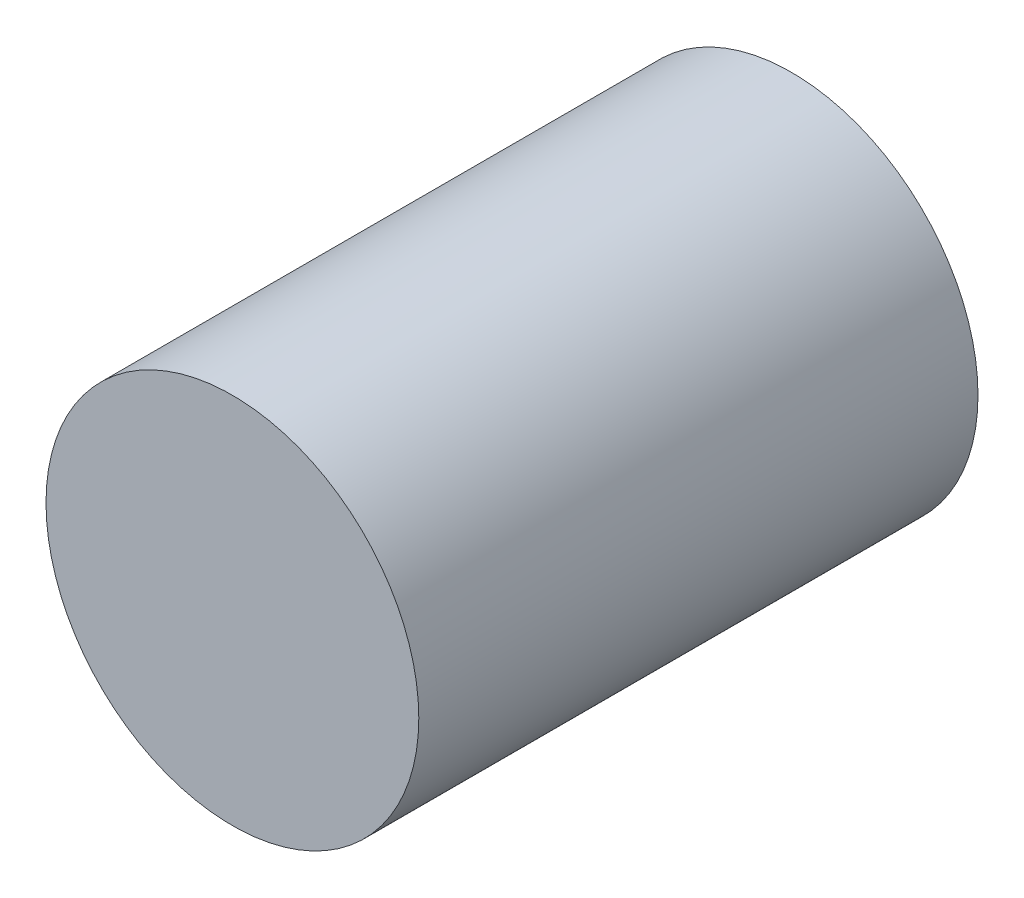
ISO-10303-21;
HEADER;
FILE_DESCRIPTION(('STEP AP214'),'2;1');
FILE_NAME('part.step','',(''),(''),'','','');
FILE_SCHEMA(('AUTOMOTIVE_DESIGN { 1 0 10303 214 1 1 1 1 }'));
ENDSEC;
DATA;
#1=APPLICATION_CONTEXT('core data for automotive mechanical design processes');
#2=APPLICATION_PROTOCOL_DEFINITION('international standard','automotive_design',2000,#1);
#3=PRODUCT_CONTEXT('',#1,'mechanical');
#4=PRODUCT('Part','Part','',(#3));
#5=PRODUCT_RELATED_PRODUCT_CATEGORY('part','',(#4));
#6=PRODUCT_DEFINITION_FORMATION('','',#4);
#7=PRODUCT_DEFINITION_CONTEXT('part definition',#1,'design');
#8=PRODUCT_DEFINITION('design','',#6,#7);
#9=PRODUCT_DEFINITION_SHAPE('','',#8);
#10=(LENGTH_UNIT() NAMED_UNIT(*) SI_UNIT(.MILLI.,.METRE.));
#11=(NAMED_UNIT(*) PLANE_ANGLE_UNIT() SI_UNIT($,.RADIAN.));
#12=(NAMED_UNIT(*) SI_UNIT($,.STERADIAN.) SOLID_ANGLE_UNIT());
#13=UNCERTAINTY_MEASURE_WITH_UNIT(LENGTH_MEASURE(1.E-05),#10,'distance_accuracy_value','');
#14=(GEOMETRIC_REPRESENTATION_CONTEXT(3) GLOBAL_UNCERTAINTY_ASSIGNED_CONTEXT((#13)) GLOBAL_UNIT_ASSIGNED_CONTEXT((#10,
#11,#12)) REPRESENTATION_CONTEXT('',''));
#15=CARTESIAN_POINT('',(0.,0.,0.));
#16=DIRECTION('',(0.,0.,1.));
#17=DIRECTION('',(1.,0.,0.));
#18=AXIS2_PLACEMENT_3D('',#15,#16,#17);
#19=CARTESIAN_POINT('',(0.,0.,3.));
#20=DIRECTION('',(0.,0.,-1.));
#21=DIRECTION('',(-1.,0.,0.));
#22=AXIS2_PLACEMENT_3D('',#19,#20,#21);
#23=CYLINDRICAL_SURFACE('',#22,1.);
#24=CARTESIAN_POINT('',(0.,0.,3.));
#25=DIRECTION('',(0.,0.,1.));
#26=DIRECTION('',(1.,0.,0.));
#27=AXIS2_PLACEMENT_3D('',#24,#25,#26);
#28=CIRCLE('',#27,1.);
#29=CARTESIAN_POINT('',(1.,0.,3.));
#30=VERTEX_POINT('',#29);
#31=EDGE_CURVE('E10',#30,#30,#28,.T.);
#32=ORIENTED_EDGE('',*,*,#31,.F.);
#33=EDGE_LOOP('',(#32));
#34=FACE_BOUND('',#33,.T.);
#35=CARTESIAN_POINT('',(0.,0.,0.));
#36=DIRECTION('',(0.,0.,1.));
#37=DIRECTION('',(1.,0.,0.));
#38=AXIS2_PLACEMENT_3D('',#35,#36,#37);
#39=CIRCLE('',#38,1.);
#40=CARTESIAN_POINT('',(1.,0.,0.));
#41=VERTEX_POINT('',#40);
#42=EDGE_CURVE('E44',#41,#41,#39,.T.);
#43=ORIENTED_EDGE('',*,*,#42,.T.);
#44=EDGE_LOOP('',(#43));
#45=FACE_BOUND('',#44,.T.);
#46=ADVANCED_FACE('F41',(#34,#45),#23,.T.);
#47=CARTESIAN_POINT('',(0.,0.,3.));
#48=DIRECTION('',(0.,0.,1.));
#49=DIRECTION('',(1.,0.,0.));
#50=AXIS2_PLACEMENT_3D('',#47,#48,#49);
#51=PLANE('',#50);
#52=ORIENTED_EDGE('',*,*,#31,.T.);
#53=EDGE_LOOP('',(#52));
#54=FACE_BOUND('',#53,.T.);
#55=ADVANCED_FACE('F58',(#54),#51,.T.);
#56=CARTESIAN_POINT('',(0.,0.,0.));
#57=DIRECTION('',(0.,0.,1.));
#58=DIRECTION('',(1.,0.,0.));
#59=AXIS2_PLACEMENT_3D('',#56,#57,#58);
#60=PLANE('',#59);
#61=ORIENTED_EDGE('',*,*,#42,.F.);
#62=EDGE_LOOP('',(#61));
#63=FACE_BOUND('',#62,.T.);
#64=ADVANCED_FACE('F56',(#63),#60,.F.);
#65=CLOSED_SHELL('',(#46,#55,#64));
#66=MANIFOLD_SOLID_BREP('B2',#65);
#67=ADVANCED_BREP_SHAPE_REPRESENTATION('',(#18,#66),#14);
#68=SHAPE_DEFINITION_REPRESENTATION(#9,#67);
ENDSEC;
END-ISO-10303-21;
